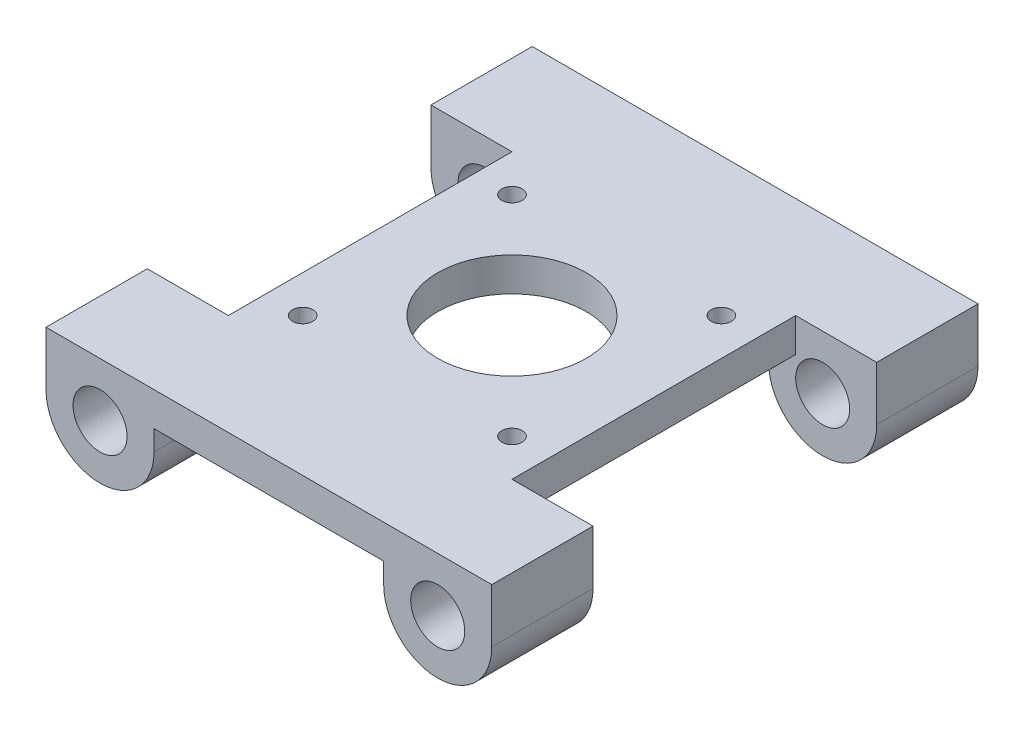
ISO-10303-21;
HEADER;
FILE_DESCRIPTION(('STEP AP214'),'2;1');
FILE_NAME('part.step','',(''),(''),'','','');
FILE_SCHEMA(('AUTOMOTIVE_DESIGN { 1 0 10303 214 1 1 1 1 }'));
ENDSEC;
DATA;
#1=APPLICATION_CONTEXT('core data for automotive mechanical design processes');
#2=APPLICATION_PROTOCOL_DEFINITION('international standard','automotive_design',2000,#1);
#3=PRODUCT_CONTEXT('',#1,'mechanical');
#4=PRODUCT('Part','Part','',(#3));
#5=PRODUCT_RELATED_PRODUCT_CATEGORY('part','',(#4));
#6=PRODUCT_DEFINITION_FORMATION('','',#4);
#7=PRODUCT_DEFINITION_CONTEXT('part definition',#1,'design');
#8=PRODUCT_DEFINITION('design','',#6,#7);
#9=PRODUCT_DEFINITION_SHAPE('','',#8);
#10=(LENGTH_UNIT() NAMED_UNIT(*) SI_UNIT(.MILLI.,.METRE.));
#11=(NAMED_UNIT(*) PLANE_ANGLE_UNIT() SI_UNIT($,.RADIAN.));
#12=(NAMED_UNIT(*) SI_UNIT($,.STERADIAN.) SOLID_ANGLE_UNIT());
#13=UNCERTAINTY_MEASURE_WITH_UNIT(LENGTH_MEASURE(1.E-05),#10,'distance_accuracy_value','');
#14=(GEOMETRIC_REPRESENTATION_CONTEXT(3) GLOBAL_UNCERTAINTY_ASSIGNED_CONTEXT((#13)) GLOBAL_UNIT_ASSIGNED_CONTEXT((#10,
#11,#12)) REPRESENTATION_CONTEXT('',''));
#15=CARTESIAN_POINT('',(0.,0.,0.));
#16=DIRECTION('',(0.,0.,1.));
#17=DIRECTION('',(1.,0.,0.));
#18=AXIS2_PLACEMENT_3D('',#15,#16,#17);
#19=CARTESIAN_POINT('',(-25.,-8.00000000000001,-15.));
#20=DIRECTION('',(0.,0.,1.));
#21=DIRECTION('',(1.,0.,0.));
#22=AXIS2_PLACEMENT_3D('',#19,#20,#21);
#23=PLANE('',#22);
#24=CARTESIAN_POINT('',(25.,-8.,-15.));
#25=DIRECTION('',(0.,0.,1.));
#26=DIRECTION('',(-1.,0.,0.));
#27=AXIS2_PLACEMENT_3D('',#24,#25,#26);
#28=CIRCLE('',#27,4.00000000000001);
#29=CARTESIAN_POINT('',(21.,-8.,-15.));
#30=VERTEX_POINT('',#29);
#31=EDGE_CURVE('E292',#30,#30,#28,.T.);
#32=ORIENTED_EDGE('',*,*,#31,.T.);
#33=EDGE_LOOP('',(#32));
#34=FACE_BOUND('',#33,.T.);
#35=DIRECTION('',(0.,-1.,0.));
#36=VECTOR('',#35,1.);
#37=CARTESIAN_POINT('',(21.,0.,-15.));
#38=LINE('',#37,#36);
#39=CARTESIAN_POINT('',(21.,0.,-15.));
#40=VERTEX_POINT('',#39);
#41=CARTESIAN_POINT('',(21.,-5.,-15.));
#42=VERTEX_POINT('',#41);
#43=EDGE_CURVE('E251',#40,#42,#38,.T.);
#44=ORIENTED_EDGE('',*,*,#43,.F.);
#45=DIRECTION('',(-1.,0.,0.));
#46=VECTOR('',#45,1.);
#47=CARTESIAN_POINT('',(33.,0.,-15.));
#48=LINE('',#47,#46);
#49=CARTESIAN_POINT('',(33.,0.,-15.));
#50=VERTEX_POINT('',#49);
#51=EDGE_CURVE('E335',#50,#40,#48,.T.);
#52=ORIENTED_EDGE('',*,*,#51,.F.);
#53=DIRECTION('',(0.,1.,0.));
#54=VECTOR('',#53,1.);
#55=CARTESIAN_POINT('',(33.,0.,-15.));
#56=LINE('',#55,#54);
#57=CARTESIAN_POINT('',(33.,-8.,-15.));
#58=VERTEX_POINT('',#57);
#59=EDGE_CURVE('E322',#58,#50,#56,.T.);
#60=ORIENTED_EDGE('',*,*,#59,.F.);
#61=CARTESIAN_POINT('',(25.,-8.,-15.));
#62=DIRECTION('',(0.,0.,1.));
#63=DIRECTION('',(-1.,0.,0.));
#64=AXIS2_PLACEMENT_3D('',#61,#62,#63);
#65=CIRCLE('',#64,7.99999999999999);
#66=CARTESIAN_POINT('',(17.,-8.,-15.));
#67=VERTEX_POINT('',#66);
#68=EDGE_CURVE('E318',#67,#58,#65,.T.);
#69=ORIENTED_EDGE('',*,*,#68,.F.);
#70=DIRECTION('',(0.,-1.,0.));
#71=VECTOR('',#70,1.);
#72=CARTESIAN_POINT('',(17.,-5.,-15.));
#73=LINE('',#72,#71);
#74=CARTESIAN_POINT('',(17.,-5.,-15.));
#75=VERTEX_POINT('',#74);
#76=EDGE_CURVE('E310',#75,#67,#73,.T.);
#77=ORIENTED_EDGE('',*,*,#76,.F.);
#78=DIRECTION('',(-1.,0.,0.));
#79=VECTOR('',#78,1.);
#80=CARTESIAN_POINT('',(21.,-5.,-15.));
#81=LINE('',#80,#79);
#82=EDGE_CURVE('E255',#42,#75,#81,.T.);
#83=ORIENTED_EDGE('',*,*,#82,.F.);
#84=EDGE_LOOP('',(#44,#52,#60,#69,#77,#83));
#85=FACE_BOUND('',#84,.T.);
#86=ADVANCED_FACE('F33',(#34,#85),#23,.F.);
#87=CARTESIAN_POINT('',(-25.,-8.00000000000001,-15.));
#88=DIRECTION('',(0.,0.,1.));
#89=DIRECTION('',(1.,0.,0.));
#90=AXIS2_PLACEMENT_3D('',#87,#88,#89);
#91=CIRCLE('',#90,4.00000000000001);
#92=CARTESIAN_POINT('',(-21.,-8.00000000000001,-15.));
#93=VERTEX_POINT('',#92);
#94=EDGE_CURVE('E370',#93,#93,#91,.T.);
#95=ORIENTED_EDGE('',*,*,#94,.T.);
#96=EDGE_LOOP('',(#95));
#97=FACE_BOUND('',#96,.T.);
#98=DIRECTION('',(0.,1.,0.));
#99=VECTOR('',#98,1.);
#100=CARTESIAN_POINT('',(-21.,0.,-15.));
#101=LINE('',#100,#99);
#102=CARTESIAN_POINT('',(-21.,-5.,-15.));
#103=VERTEX_POINT('',#102);
#104=CARTESIAN_POINT('',(-21.,0.,-15.));
#105=VERTEX_POINT('',#104);
#106=EDGE_CURVE('E261',#103,#105,#101,.T.);
#107=ORIENTED_EDGE('',*,*,#106,.F.);
#108=CARTESIAN_POINT('',(-17.,-5.00000000000001,-15.));
#109=VERTEX_POINT('',#108);
#110=EDGE_CURVE('E11',#109,#103,#81,.T.);
#111=ORIENTED_EDGE('',*,*,#110,.F.);
#112=DIRECTION('',(0.,1.,0.));
#113=VECTOR('',#112,1.);
#114=CARTESIAN_POINT('',(-17.,-5.00000000000001,-15.));
#115=LINE('',#114,#113);
#116=CARTESIAN_POINT('',(-17.,-8.00000000000001,-15.));
#117=VERTEX_POINT('',#116);
#118=EDGE_CURVE('E307',#117,#109,#115,.T.);
#119=ORIENTED_EDGE('',*,*,#118,.F.);
#120=CARTESIAN_POINT('',(-25.,-8.00000000000001,-15.));
#121=DIRECTION('',(0.,0.,1.));
#122=DIRECTION('',(1.,0.,0.));
#123=AXIS2_PLACEMENT_3D('',#120,#121,#122);
#124=CIRCLE('',#123,7.99999999999999);
#125=CARTESIAN_POINT('',(-33.,-8.00000000000001,-15.));
#126=VERTEX_POINT('',#125);
#127=EDGE_CURVE('E311',#126,#117,#124,.T.);
#128=ORIENTED_EDGE('',*,*,#127,.F.);
#129=DIRECTION('',(0.,-1.,0.));
#130=VECTOR('',#129,1.);
#131=CARTESIAN_POINT('',(-33.,0.,-15.));
#132=LINE('',#131,#130);
#133=CARTESIAN_POINT('',(-33.,0.,-15.));
#134=VERTEX_POINT('',#133);
#135=EDGE_CURVE('E350',#134,#126,#132,.T.);
#136=ORIENTED_EDGE('',*,*,#135,.F.);
#137=EDGE_CURVE('E296',#105,#134,#48,.T.);
#138=ORIENTED_EDGE('',*,*,#137,.F.);
#139=EDGE_LOOP('',(#107,#111,#119,#128,#136,#138));
#140=FACE_BOUND('',#139,.T.);
#141=ADVANCED_FACE('F390',(#97,#140),#23,.F.);
#142=CARTESIAN_POINT('',(-33.,0.,-15.));
#143=DIRECTION('',(-1.,0.,0.));
#144=DIRECTION('',(0.,-1.,0.));
#145=AXIS2_PLACEMENT_3D('',#142,#143,#144);
#146=PLANE('',#145);
#147=DIRECTION('',(0.,-1.,0.));
#148=VECTOR('',#147,1.);
#149=CARTESIAN_POINT('',(-33.,0.,0.));
#150=LINE('',#149,#148);
#151=CARTESIAN_POINT('',(-33.,0.,0.));
#152=VERTEX_POINT('',#151);
#153=CARTESIAN_POINT('',(-33.,-8.00000000000001,0.));
#154=VERTEX_POINT('',#153);
#155=EDGE_CURVE('E332',#152,#154,#150,.T.);
#156=ORIENTED_EDGE('',*,*,#155,.F.);
#157=DIRECTION('',(0.,0.,1.));
#158=VECTOR('',#157,1.);
#159=CARTESIAN_POINT('',(-33.,0.,-15.));
#160=LINE('',#159,#158);
#161=EDGE_CURVE('E42',#134,#152,#160,.T.);
#162=ORIENTED_EDGE('',*,*,#161,.F.);
#163=ORIENTED_EDGE('',*,*,#135,.T.);
#164=DIRECTION('',(0.,0.,1.));
#165=VECTOR('',#164,1.);
#166=CARTESIAN_POINT('',(-33.,-8.00000000000001,-15.));
#167=LINE('',#166,#165);
#168=EDGE_CURVE('E338',#126,#154,#167,.T.);
#169=ORIENTED_EDGE('',*,*,#168,.T.);
#170=EDGE_LOOP('',(#156,#162,#163,#169));
#171=FACE_BOUND('',#170,.T.);
#172=ADVANCED_FACE('F35',(#171),#146,.T.);
#173=CARTESIAN_POINT('',(33.,0.,-15.));
#174=DIRECTION('',(0.,1.,0.));
#175=DIRECTION('',(-1.,0.,0.));
#176=AXIS2_PLACEMENT_3D('',#173,#174,#175);
#177=PLANE('',#176);
#178=CARTESIAN_POINT('',(-15.4999999999997,0.,-20.5));
#179=DIRECTION('',(0.,1.,0.));
#180=DIRECTION('',(-1.,0.,0.));
#181=AXIS2_PLACEMENT_3D('',#178,#179,#180);
#182=CIRCLE('',#181,1.5);
#183=CARTESIAN_POINT('',(-16.9999999999997,0.,-20.5));
#184=VERTEX_POINT('',#183);
#185=EDGE_CURVE('E707',#184,#184,#182,.T.);
#186=ORIENTED_EDGE('',*,*,#185,.F.);
#187=EDGE_LOOP('',(#186));
#188=FACE_BOUND('',#187,.T.);
#189=CARTESIAN_POINT('',(15.5000000000003,0.,-20.5));
#190=DIRECTION('',(0.,1.,0.));
#191=DIRECTION('',(-1.,0.,0.));
#192=AXIS2_PLACEMENT_3D('',#189,#190,#191);
#193=CIRCLE('',#192,1.5);
#194=CARTESIAN_POINT('',(14.0000000000003,0.,-20.5));
#195=VERTEX_POINT('',#194);
#196=EDGE_CURVE('E709',#195,#195,#193,.T.);
#197=ORIENTED_EDGE('',*,*,#196,.F.);
#198=EDGE_LOOP('',(#197));
#199=FACE_BOUND('',#198,.T.);
#200=CARTESIAN_POINT('',(15.5,0.,-51.5));
#201=DIRECTION('',(0.,1.,0.));
#202=DIRECTION('',(-1.,0.,0.));
#203=AXIS2_PLACEMENT_3D('',#200,#201,#202);
#204=CIRCLE('',#203,1.5);
#205=CARTESIAN_POINT('',(14.,0.,-51.5));
#206=VERTEX_POINT('',#205);
#207=EDGE_CURVE('E714',#206,#206,#204,.T.);
#208=ORIENTED_EDGE('',*,*,#207,.F.);
#209=EDGE_LOOP('',(#208));
#210=FACE_BOUND('',#209,.T.);
#211=CARTESIAN_POINT('',(0.,0.,-36.));
#212=DIRECTION('',(0.,1.,0.));
#213=DIRECTION('',(-1.,0.,0.));
#214=AXIS2_PLACEMENT_3D('',#211,#212,#213);
#215=CIRCLE('',#214,11.);
#216=CARTESIAN_POINT('',(-11.,0.,-36.));
#217=VERTEX_POINT('',#216);
#218=EDGE_CURVE('E718',#217,#217,#215,.T.);
#219=ORIENTED_EDGE('',*,*,#218,.F.);
#220=EDGE_LOOP('',(#219));
#221=FACE_BOUND('',#220,.T.);
#222=CARTESIAN_POINT('',(-15.5,0.,-51.5));
#223=DIRECTION('',(0.,1.,0.));
#224=DIRECTION('',(-1.,0.,0.));
#225=AXIS2_PLACEMENT_3D('',#222,#223,#224);
#226=CIRCLE('',#225,1.5);
#227=CARTESIAN_POINT('',(-17.,0.,-51.5));
#228=VERTEX_POINT('',#227);
#229=EDGE_CURVE('E722',#228,#228,#226,.T.);
#230=ORIENTED_EDGE('',*,*,#229,.F.);
#231=EDGE_LOOP('',(#230));
#232=FACE_BOUND('',#231,.T.);
#233=DIRECTION('',(-1.,0.,0.));
#234=VECTOR('',#233,1.);
#235=CARTESIAN_POINT('',(33.,0.,0.));
#236=LINE('',#235,#234);
#237=CARTESIAN_POINT('',(33.,0.,0.));
#238=VERTEX_POINT('',#237);
#239=EDGE_CURVE('E347',#238,#152,#236,.T.);
#240=ORIENTED_EDGE('',*,*,#239,.F.);
#241=DIRECTION('',(0.,0.,1.));
#242=VECTOR('',#241,1.);
#243=CARTESIAN_POINT('',(33.,0.,-15.));
#244=LINE('',#243,#242);
#245=EDGE_CURVE('E344',#50,#238,#244,.T.);
#246=ORIENTED_EDGE('',*,*,#245,.F.);
#247=ORIENTED_EDGE('',*,*,#51,.T.);
#248=DIRECTION('',(0.,0.,1.));
#249=VECTOR('',#248,1.);
#250=CARTESIAN_POINT('',(21.,0.,-57.));
#251=LINE('',#250,#249);
#252=CARTESIAN_POINT('',(21.,0.,-57.));
#253=VERTEX_POINT('',#252);
#254=EDGE_CURVE('E269',#253,#40,#251,.T.);
#255=ORIENTED_EDGE('',*,*,#254,.F.);
#256=DIRECTION('',(-1.,0.,0.));
#257=VECTOR('',#256,1.);
#258=CARTESIAN_POINT('',(33.,0.,-57.));
#259=LINE('',#258,#257);
#260=CARTESIAN_POINT('',(33.,0.,-57.));
#261=VERTEX_POINT('',#260);
#262=EDGE_CURVE('E200',#261,#253,#259,.T.);
#263=ORIENTED_EDGE('',*,*,#262,.F.);
#264=DIRECTION('',(0.,0.,1.));
#265=VECTOR('',#264,1.);
#266=CARTESIAN_POINT('',(33.,0.,-72.));
#267=LINE('',#266,#265);
#268=CARTESIAN_POINT('',(33.,0.,-72.));
#269=VERTEX_POINT('',#268);
#270=EDGE_CURVE('E248',#269,#261,#267,.T.);
#271=ORIENTED_EDGE('',*,*,#270,.F.);
#272=DIRECTION('',(-1.,0.,0.));
#273=VECTOR('',#272,1.);
#274=CARTESIAN_POINT('',(33.,0.,-72.));
#275=LINE('',#274,#273);
#276=CARTESIAN_POINT('',(-33.,0.,-72.));
#277=VERTEX_POINT('',#276);
#278=EDGE_CURVE('E184',#269,#277,#275,.T.);
#279=ORIENTED_EDGE('',*,*,#278,.T.);
#280=DIRECTION('',(0.,0.,1.));
#281=VECTOR('',#280,1.);
#282=CARTESIAN_POINT('',(-33.,0.,-72.));
#283=LINE('',#282,#281);
#284=CARTESIAN_POINT('',(-33.,0.,-57.));
#285=VERTEX_POINT('',#284);
#286=EDGE_CURVE('E199',#277,#285,#283,.T.);
#287=ORIENTED_EDGE('',*,*,#286,.T.);
#288=CARTESIAN_POINT('',(-21.,0.,-57.));
#289=VERTEX_POINT('',#288);
#290=EDGE_CURVE('E203',#289,#285,#259,.T.);
#291=ORIENTED_EDGE('',*,*,#290,.F.);
#292=DIRECTION('',(0.,0.,1.));
#293=VECTOR('',#292,1.);
#294=CARTESIAN_POINT('',(-21.,0.,-57.));
#295=LINE('',#294,#293);
#296=EDGE_CURVE('E271',#289,#105,#295,.T.);
#297=ORIENTED_EDGE('',*,*,#296,.T.);
#298=ORIENTED_EDGE('',*,*,#137,.T.);
#299=ORIENTED_EDGE('',*,*,#161,.T.);
#300=EDGE_LOOP('',(#240,#246,#247,#255,#263,#271,#279,#287,#291,#297,#298,#299));
#301=FACE_BOUND('',#300,.T.);
#302=ADVANCED_FACE('F404',(#188,#199,#210,#221,#232,#301),#177,.T.);
#303=CARTESIAN_POINT('',(33.,0.,-15.));
#304=DIRECTION('',(1.,0.,0.));
#305=DIRECTION('',(0.,1.,0.));
#306=AXIS2_PLACEMENT_3D('',#303,#304,#305);
#307=PLANE('',#306);
#308=DIRECTION('',(0.,1.,0.));
#309=VECTOR('',#308,1.);
#310=CARTESIAN_POINT('',(33.,0.,0.));
#311=LINE('',#310,#309);
#312=CARTESIAN_POINT('',(33.,-8.,0.));
#313=VERTEX_POINT('',#312);
#314=EDGE_CURVE('E351',#313,#238,#311,.T.);
#315=ORIENTED_EDGE('',*,*,#314,.F.);
#316=DIRECTION('',(0.,0.,1.));
#317=VECTOR('',#316,1.);
#318=CARTESIAN_POINT('',(33.,-8.,-15.));
#319=LINE('',#318,#317);
#320=EDGE_CURVE('E342',#58,#313,#319,.T.);
#321=ORIENTED_EDGE('',*,*,#320,.F.);
#322=ORIENTED_EDGE('',*,*,#59,.T.);
#323=ORIENTED_EDGE('',*,*,#245,.T.);
#324=EDGE_LOOP('',(#315,#321,#322,#323));
#325=FACE_BOUND('',#324,.T.);
#326=ADVANCED_FACE('F411',(#325),#307,.T.);
#327=CARTESIAN_POINT('',(25.,-8.,-15.));
#328=DIRECTION('',(0.,0.,1.));
#329=DIRECTION('',(1.,0.,0.));
#330=AXIS2_PLACEMENT_3D('',#327,#328,#329);
#331=CYLINDRICAL_SURFACE('',#330,7.99999999999999);
#332=CARTESIAN_POINT('',(25.,-8.,0.));
#333=DIRECTION('',(0.,0.,1.));
#334=DIRECTION('',(-1.,0.,0.));
#335=AXIS2_PLACEMENT_3D('',#332,#333,#334);
#336=CIRCLE('',#335,7.99999999999999);
#337=CARTESIAN_POINT('',(17.,-8.,0.));
#338=VERTEX_POINT('',#337);
#339=EDGE_CURVE('E354',#338,#313,#336,.T.);
#340=ORIENTED_EDGE('',*,*,#339,.F.);
#341=DIRECTION('',(0.,0.,1.));
#342=VECTOR('',#341,1.);
#343=CARTESIAN_POINT('',(17.,-8.,-15.));
#344=LINE('',#343,#342);
#345=EDGE_CURVE('E315',#67,#338,#344,.T.);
#346=ORIENTED_EDGE('',*,*,#345,.F.);
#347=ORIENTED_EDGE('',*,*,#68,.T.);
#348=ORIENTED_EDGE('',*,*,#320,.T.);
#349=EDGE_LOOP('',(#340,#346,#347,#348));
#350=FACE_BOUND('',#349,.T.);
#351=ADVANCED_FACE('F400',(#350),#331,.T.);
#352=CARTESIAN_POINT('',(17.,-5.,-15.));
#353=DIRECTION('',(-1.,0.,0.));
#354=DIRECTION('',(0.,0.,1.));
#355=AXIS2_PLACEMENT_3D('',#352,#353,#354);
#356=PLANE('',#355);
#357=DIRECTION('',(0.,-1.,0.));
#358=VECTOR('',#357,1.);
#359=CARTESIAN_POINT('',(17.,-5.,0.));
#360=LINE('',#359,#358);
#361=CARTESIAN_POINT('',(17.,-5.,0.));
#362=VERTEX_POINT('',#361);
#363=EDGE_CURVE('E357',#362,#338,#360,.T.);
#364=ORIENTED_EDGE('',*,*,#363,.F.);
#365=DIRECTION('',(0.,0.,1.));
#366=VECTOR('',#365,1.);
#367=CARTESIAN_POINT('',(17.,-5.,-15.));
#368=LINE('',#367,#366);
#369=EDGE_CURVE('E303',#75,#362,#368,.T.);
#370=ORIENTED_EDGE('',*,*,#369,.F.);
#371=ORIENTED_EDGE('',*,*,#76,.T.);
#372=ORIENTED_EDGE('',*,*,#345,.T.);
#373=EDGE_LOOP('',(#364,#370,#371,#372));
#374=FACE_BOUND('',#373,.T.);
#375=ADVANCED_FACE('F398',(#374),#356,.T.);
#376=CARTESIAN_POINT('',(17.,-5.,-15.));
#377=DIRECTION('',(0.,-1.,0.));
#378=DIRECTION('',(1.,0.,0.));
#379=AXIS2_PLACEMENT_3D('',#376,#377,#378);
#380=PLANE('',#379);
#381=CARTESIAN_POINT('',(-15.4999999999997,-5.,-20.5));
#382=DIRECTION('',(0.,-1.,0.));
#383=DIRECTION('',(1.,0.,0.));
#384=AXIS2_PLACEMENT_3D('',#381,#382,#383);
#385=CIRCLE('',#384,1.5);
#386=CARTESIAN_POINT('',(-13.9999999999997,-5.,-20.5));
#387=VERTEX_POINT('',#386);
#388=EDGE_CURVE('E37',#387,#387,#385,.T.);
#389=ORIENTED_EDGE('',*,*,#388,.F.);
#390=EDGE_LOOP('',(#389));
#391=FACE_BOUND('',#390,.T.);
#392=CARTESIAN_POINT('',(15.5000000000003,-5.,-20.5));
#393=DIRECTION('',(0.,-1.,0.));
#394=DIRECTION('',(1.,0.,0.));
#395=AXIS2_PLACEMENT_3D('',#392,#393,#394);
#396=CIRCLE('',#395,1.5);
#397=CARTESIAN_POINT('',(17.0000000000003,-5.,-20.5));
#398=VERTEX_POINT('',#397);
#399=EDGE_CURVE('E713',#398,#398,#396,.T.);
#400=ORIENTED_EDGE('',*,*,#399,.F.);
#401=EDGE_LOOP('',(#400));
#402=FACE_BOUND('',#401,.T.);
#403=CARTESIAN_POINT('',(15.5,-5.,-51.5));
#404=DIRECTION('',(0.,-1.,0.));
#405=DIRECTION('',(1.,0.,0.));
#406=AXIS2_PLACEMENT_3D('',#403,#404,#405);
#407=CIRCLE('',#406,1.5);
#408=CARTESIAN_POINT('',(17.,-5.,-51.5));
#409=VERTEX_POINT('',#408);
#410=EDGE_CURVE('E717',#409,#409,#407,.T.);
#411=ORIENTED_EDGE('',*,*,#410,.F.);
#412=EDGE_LOOP('',(#411));
#413=FACE_BOUND('',#412,.T.);
#414=CARTESIAN_POINT('',(0.,-5.,-36.));
#415=DIRECTION('',(0.,-1.,0.));
#416=DIRECTION('',(1.,0.,0.));
#417=AXIS2_PLACEMENT_3D('',#414,#415,#416);
#418=CIRCLE('',#417,11.);
#419=CARTESIAN_POINT('',(11.,-5.,-36.));
#420=VERTEX_POINT('',#419);
#421=EDGE_CURVE('E721',#420,#420,#418,.T.);
#422=ORIENTED_EDGE('',*,*,#421,.F.);
#423=EDGE_LOOP('',(#422));
#424=FACE_BOUND('',#423,.T.);
#425=CARTESIAN_POINT('',(-15.5,-5.,-51.5));
#426=DIRECTION('',(0.,-1.,0.));
#427=DIRECTION('',(1.,0.,0.));
#428=AXIS2_PLACEMENT_3D('',#425,#426,#427);
#429=CIRCLE('',#428,1.5);
#430=CARTESIAN_POINT('',(-14.,-5.,-51.5));
#431=VERTEX_POINT('',#430);
#432=EDGE_CURVE('E725',#431,#431,#429,.T.);
#433=ORIENTED_EDGE('',*,*,#432,.F.);
#434=EDGE_LOOP('',(#433));
#435=FACE_BOUND('',#434,.T.);
#436=DIRECTION('',(1.,0.,0.));
#437=VECTOR('',#436,1.);
#438=CARTESIAN_POINT('',(17.,-5.,0.));
#439=LINE('',#438,#437);
#440=CARTESIAN_POINT('',(-17.,-5.00000000000001,0.));
#441=VERTEX_POINT('',#440);
#442=EDGE_CURVE('E360',#441,#362,#439,.T.);
#443=ORIENTED_EDGE('',*,*,#442,.F.);
#444=DIRECTION('',(0.,0.,1.));
#445=VECTOR('',#444,1.);
#446=CARTESIAN_POINT('',(-17.,-5.00000000000001,-15.));
#447=LINE('',#446,#445);
#448=EDGE_CURVE('E301',#109,#441,#447,.T.);
#449=ORIENTED_EDGE('',*,*,#448,.F.);
#450=ORIENTED_EDGE('',*,*,#110,.T.);
#451=DIRECTION('',(0.,0.,1.));
#452=VECTOR('',#451,1.);
#453=CARTESIAN_POINT('',(-21.,-5.,-57.));
#454=LINE('',#453,#452);
#455=CARTESIAN_POINT('',(-21.,-5.,-57.));
#456=VERTEX_POINT('',#455);
#457=EDGE_CURVE('E284',#456,#103,#454,.T.);
#458=ORIENTED_EDGE('',*,*,#457,.F.);
#459=DIRECTION('',(-1.,0.,0.));
#460=VECTOR('',#459,1.);
#461=CARTESIAN_POINT('',(21.,-5.,-57.));
#462=LINE('',#461,#460);
#463=CARTESIAN_POINT('',(-17.,-5.,-57.));
#464=VERTEX_POINT('',#463);
#465=EDGE_CURVE('E50',#464,#456,#462,.T.);
#466=ORIENTED_EDGE('',*,*,#465,.F.);
#467=DIRECTION('',(0.,0.,1.));
#468=VECTOR('',#467,1.);
#469=CARTESIAN_POINT('',(-17.,-5.00000000000001,-72.));
#470=LINE('',#469,#468);
#471=CARTESIAN_POINT('',(-17.,-5.00000000000001,-72.));
#472=VERTEX_POINT('',#471);
#473=EDGE_CURVE('E243',#472,#464,#470,.T.);
#474=ORIENTED_EDGE('',*,*,#473,.F.);
#475=DIRECTION('',(1.,0.,0.));
#476=VECTOR('',#475,1.);
#477=CARTESIAN_POINT('',(17.,-5.,-72.));
#478=LINE('',#477,#476);
#479=CARTESIAN_POINT('',(17.,-5.,-72.));
#480=VERTEX_POINT('',#479);
#481=EDGE_CURVE('E210',#472,#480,#478,.T.);
#482=ORIENTED_EDGE('',*,*,#481,.T.);
#483=DIRECTION('',(0.,0.,1.));
#484=VECTOR('',#483,1.);
#485=CARTESIAN_POINT('',(17.,-5.,-72.));
#486=LINE('',#485,#484);
#487=CARTESIAN_POINT('',(17.,-5.,-57.));
#488=VERTEX_POINT('',#487);
#489=EDGE_CURVE('E247',#480,#488,#486,.T.);
#490=ORIENTED_EDGE('',*,*,#489,.T.);
#491=CARTESIAN_POINT('',(21.,-5.,-57.));
#492=VERTEX_POINT('',#491);
#493=EDGE_CURVE('E58',#492,#488,#462,.T.);
#494=ORIENTED_EDGE('',*,*,#493,.F.);
#495=DIRECTION('',(0.,0.,1.));
#496=VECTOR('',#495,1.);
#497=CARTESIAN_POINT('',(21.,-5.,-57.));
#498=LINE('',#497,#496);
#499=EDGE_CURVE('E287',#492,#42,#498,.T.);
#500=ORIENTED_EDGE('',*,*,#499,.T.);
#501=ORIENTED_EDGE('',*,*,#82,.T.);
#502=ORIENTED_EDGE('',*,*,#369,.T.);
#503=EDGE_LOOP('',(#443,#449,#450,#458,#466,#474,#482,#490,#494,#500,#501,#502));
#504=FACE_BOUND('',#503,.T.);
#505=ADVANCED_FACE('F397',(#391,#402,#413,#424,#435,#504),#380,.T.);
#506=CARTESIAN_POINT('',(-17.,-5.00000000000001,-15.));
#507=DIRECTION('',(1.,0.,0.));
#508=DIRECTION('',(0.,0.,-1.));
#509=AXIS2_PLACEMENT_3D('',#506,#507,#508);
#510=PLANE('',#509);
#511=DIRECTION('',(0.,1.,0.));
#512=VECTOR('',#511,1.);
#513=CARTESIAN_POINT('',(-17.,-5.00000000000001,0.));
#514=LINE('',#513,#512);
#515=CARTESIAN_POINT('',(-17.,-8.00000000000001,0.));
#516=VERTEX_POINT('',#515);
#517=EDGE_CURVE('E363',#516,#441,#514,.T.);
#518=ORIENTED_EDGE('',*,*,#517,.F.);
#519=DIRECTION('',(0.,0.,1.));
#520=VECTOR('',#519,1.);
#521=CARTESIAN_POINT('',(-17.,-8.00000000000001,-15.));
#522=LINE('',#521,#520);
#523=EDGE_CURVE('E304',#117,#516,#522,.T.);
#524=ORIENTED_EDGE('',*,*,#523,.F.);
#525=ORIENTED_EDGE('',*,*,#118,.T.);
#526=ORIENTED_EDGE('',*,*,#448,.T.);
#527=EDGE_LOOP('',(#518,#524,#525,#526));
#528=FACE_BOUND('',#527,.T.);
#529=ADVANCED_FACE('F393',(#528),#510,.T.);
#530=CARTESIAN_POINT('',(-25.,-8.00000000000001,-15.));
#531=DIRECTION('',(0.,0.,1.));
#532=DIRECTION('',(1.,0.,0.));
#533=AXIS2_PLACEMENT_3D('',#530,#531,#532);
#534=CYLINDRICAL_SURFACE('',#533,7.99999999999999);
#535=CARTESIAN_POINT('',(-25.,-8.00000000000001,0.));
#536=DIRECTION('',(0.,0.,1.));
#537=DIRECTION('',(1.,0.,0.));
#538=AXIS2_PLACEMENT_3D('',#535,#536,#537);
#539=CIRCLE('',#538,7.99999999999999);
#540=EDGE_CURVE('E365',#154,#516,#539,.T.);
#541=ORIENTED_EDGE('',*,*,#540,.F.);
#542=ORIENTED_EDGE('',*,*,#168,.F.);
#543=ORIENTED_EDGE('',*,*,#127,.T.);
#544=ORIENTED_EDGE('',*,*,#523,.T.);
#545=EDGE_LOOP('',(#541,#542,#543,#544));
#546=FACE_BOUND('',#545,.T.);
#547=ADVANCED_FACE('F386',(#546),#534,.T.);
#548=CARTESIAN_POINT('',(-25.,-8.00000000000001,0.));
#549=DIRECTION('',(0.,0.,1.));
#550=DIRECTION('',(1.,0.,0.));
#551=AXIS2_PLACEMENT_3D('',#548,#549,#550);
#552=PLANE('',#551);
#553=CARTESIAN_POINT('',(25.,-8.,0.));
#554=DIRECTION('',(0.,0.,1.));
#555=DIRECTION('',(-1.,0.,0.));
#556=AXIS2_PLACEMENT_3D('',#553,#554,#555);
#557=CIRCLE('',#556,4.00000000000001);
#558=CARTESIAN_POINT('',(21.,-8.,0.));
#559=VERTEX_POINT('',#558);
#560=EDGE_CURVE('E289',#559,#559,#557,.T.);
#561=ORIENTED_EDGE('',*,*,#560,.F.);
#562=EDGE_LOOP('',(#561));
#563=FACE_BOUND('',#562,.T.);
#564=CARTESIAN_POINT('',(-25.,-8.00000000000001,0.));
#565=DIRECTION('',(0.,0.,1.));
#566=DIRECTION('',(1.,0.,0.));
#567=AXIS2_PLACEMENT_3D('',#564,#565,#566);
#568=CIRCLE('',#567,4.00000000000001);
#569=CARTESIAN_POINT('',(-21.,-8.00000000000001,0.));
#570=VERTEX_POINT('',#569);
#571=EDGE_CURVE('E373',#570,#570,#568,.T.);
#572=ORIENTED_EDGE('',*,*,#571,.F.);
#573=EDGE_LOOP('',(#572));
#574=FACE_BOUND('',#573,.T.);
#575=ORIENTED_EDGE('',*,*,#155,.T.);
#576=ORIENTED_EDGE('',*,*,#540,.T.);
#577=ORIENTED_EDGE('',*,*,#517,.T.);
#578=ORIENTED_EDGE('',*,*,#442,.T.);
#579=ORIENTED_EDGE('',*,*,#363,.T.);
#580=ORIENTED_EDGE('',*,*,#339,.T.);
#581=ORIENTED_EDGE('',*,*,#314,.T.);
#582=ORIENTED_EDGE('',*,*,#239,.T.);
#583=EDGE_LOOP('',(#575,#576,#577,#578,#579,#580,#581,#582));
#584=FACE_BOUND('',#583,.T.);
#585=ADVANCED_FACE('F395',(#563,#574,#584),#552,.T.);
#586=CARTESIAN_POINT('',(-25.,-8.00000000000001,-15.));
#587=DIRECTION('',(0.,0.,1.));
#588=DIRECTION('',(1.,0.,0.));
#589=AXIS2_PLACEMENT_3D('',#586,#587,#588);
#590=CYLINDRICAL_SURFACE('',#589,4.00000000000001);
#591=ORIENTED_EDGE('',*,*,#94,.F.);
#592=EDGE_LOOP('',(#591));
#593=FACE_BOUND('',#592,.T.);
#594=ORIENTED_EDGE('',*,*,#571,.T.);
#595=EDGE_LOOP('',(#594));
#596=FACE_BOUND('',#595,.T.);
#597=ADVANCED_FACE('F423',(#593,#596),#590,.F.);
#598=CARTESIAN_POINT('',(25.,-8.,-15.));
#599=DIRECTION('',(0.,0.,1.));
#600=DIRECTION('',(1.,0.,0.));
#601=AXIS2_PLACEMENT_3D('',#598,#599,#600);
#602=CYLINDRICAL_SURFACE('',#601,4.00000000000001);
#603=ORIENTED_EDGE('',*,*,#31,.F.);
#604=EDGE_LOOP('',(#603));
#605=FACE_BOUND('',#604,.T.);
#606=ORIENTED_EDGE('',*,*,#560,.T.);
#607=EDGE_LOOP('',(#606));
#608=FACE_BOUND('',#607,.T.);
#609=ADVANCED_FACE('F454',(#605,#608),#602,.F.);
#610=CARTESIAN_POINT('',(21.,0.,-57.));
#611=DIRECTION('',(-1.,0.,0.));
#612=DIRECTION('',(0.,0.,1.));
#613=AXIS2_PLACEMENT_3D('',#610,#611,#612);
#614=PLANE('',#613);
#615=ORIENTED_EDGE('',*,*,#43,.T.);
#616=ORIENTED_EDGE('',*,*,#499,.F.);
#617=DIRECTION('',(0.,-1.,0.));
#618=VECTOR('',#617,1.);
#619=CARTESIAN_POINT('',(21.,0.,-57.));
#620=LINE('',#619,#618);
#621=EDGE_CURVE('E278',#253,#492,#620,.T.);
#622=ORIENTED_EDGE('',*,*,#621,.F.);
#623=ORIENTED_EDGE('',*,*,#254,.T.);
#624=EDGE_LOOP('',(#615,#616,#622,#623));
#625=FACE_BOUND('',#624,.T.);
#626=ADVANCED_FACE('F461',(#625),#614,.F.);
#627=CARTESIAN_POINT('',(-21.,0.,-57.));
#628=DIRECTION('',(1.,0.,0.));
#629=DIRECTION('',(0.,0.,-1.));
#630=AXIS2_PLACEMENT_3D('',#627,#628,#629);
#631=PLANE('',#630);
#632=ORIENTED_EDGE('',*,*,#106,.T.);
#633=ORIENTED_EDGE('',*,*,#296,.F.);
#634=DIRECTION('',(0.,1.,0.));
#635=VECTOR('',#634,1.);
#636=CARTESIAN_POINT('',(-21.,0.,-57.));
#637=LINE('',#636,#635);
#638=EDGE_CURVE('E272',#456,#289,#637,.T.);
#639=ORIENTED_EDGE('',*,*,#638,.F.);
#640=ORIENTED_EDGE('',*,*,#457,.T.);
#641=EDGE_LOOP('',(#632,#633,#639,#640));
#642=FACE_BOUND('',#641,.T.);
#643=ADVANCED_FACE('F468',(#642),#631,.F.);
#644=CARTESIAN_POINT('',(-25.,-8.00000000000001,-57.));
#645=DIRECTION('',(0.,0.,1.));
#646=DIRECTION('',(1.,0.,0.));
#647=AXIS2_PLACEMENT_3D('',#644,#645,#646);
#648=PLANE('',#647);
#649=CARTESIAN_POINT('',(25.,-8.,-57.));
#650=DIRECTION('',(0.,0.,1.));
#651=DIRECTION('',(-1.,0.,0.));
#652=AXIS2_PLACEMENT_3D('',#649,#650,#651);
#653=CIRCLE('',#652,4.00000000000001);
#654=CARTESIAN_POINT('',(21.,-8.,-57.));
#655=VERTEX_POINT('',#654);
#656=EDGE_CURVE('E729',#655,#655,#653,.T.);
#657=ORIENTED_EDGE('',*,*,#656,.F.);
#658=EDGE_LOOP('',(#657));
#659=FACE_BOUND('',#658,.T.);
#660=ORIENTED_EDGE('',*,*,#262,.T.);
#661=ORIENTED_EDGE('',*,*,#621,.T.);
#662=ORIENTED_EDGE('',*,*,#493,.T.);
#663=DIRECTION('',(0.,-1.,0.));
#664=VECTOR('',#663,1.);
#665=CARTESIAN_POINT('',(17.,-5.,-57.));
#666=LINE('',#665,#664);
#667=CARTESIAN_POINT('',(17.,-8.,-57.));
#668=VERTEX_POINT('',#667);
#669=EDGE_CURVE('E232',#488,#668,#666,.T.);
#670=ORIENTED_EDGE('',*,*,#669,.T.);
#671=CARTESIAN_POINT('',(25.,-8.,-57.));
#672=DIRECTION('',(0.,0.,1.));
#673=DIRECTION('',(-1.,0.,0.));
#674=AXIS2_PLACEMENT_3D('',#671,#672,#673);
#675=CIRCLE('',#674,7.99999999999999);
#676=CARTESIAN_POINT('',(33.,-8.,-57.));
#677=VERTEX_POINT('',#676);
#678=EDGE_CURVE('E228',#668,#677,#675,.T.);
#679=ORIENTED_EDGE('',*,*,#678,.T.);
#680=DIRECTION('',(0.,1.,0.));
#681=VECTOR('',#680,1.);
#682=CARTESIAN_POINT('',(33.,0.,-57.));
#683=LINE('',#682,#681);
#684=EDGE_CURVE('E231',#677,#261,#683,.T.);
#685=ORIENTED_EDGE('',*,*,#684,.T.);
#686=EDGE_LOOP('',(#660,#661,#662,#670,#679,#685));
#687=FACE_BOUND('',#686,.T.);
#688=ADVANCED_FACE('F475',(#659,#687),#648,.T.);
#689=CARTESIAN_POINT('',(-33.,0.,-72.));
#690=DIRECTION('',(-1.,0.,0.));
#691=DIRECTION('',(0.,-1.,0.));
#692=AXIS2_PLACEMENT_3D('',#689,#690,#691);
#693=PLANE('',#692);
#694=DIRECTION('',(0.,-1.,0.));
#695=VECTOR('',#694,1.);
#696=CARTESIAN_POINT('',(-33.,0.,-57.));
#697=LINE('',#696,#695);
#698=CARTESIAN_POINT('',(-33.,-8.00000000000001,-57.));
#699=VERTEX_POINT('',#698);
#700=EDGE_CURVE('E223',#285,#699,#697,.T.);
#701=ORIENTED_EDGE('',*,*,#700,.F.);
#702=ORIENTED_EDGE('',*,*,#286,.F.);
#703=DIRECTION('',(0.,-1.,0.));
#704=VECTOR('',#703,1.);
#705=CARTESIAN_POINT('',(-33.,0.,-72.));
#706=LINE('',#705,#704);
#707=CARTESIAN_POINT('',(-33.,-8.00000000000001,-72.));
#708=VERTEX_POINT('',#707);
#709=EDGE_CURVE('E191',#277,#708,#706,.T.);
#710=ORIENTED_EDGE('',*,*,#709,.T.);
#711=DIRECTION('',(0.,0.,1.));
#712=VECTOR('',#711,1.);
#713=CARTESIAN_POINT('',(-33.,-8.00000000000001,-72.));
#714=LINE('',#713,#712);
#715=EDGE_CURVE('E173',#708,#699,#714,.T.);
#716=ORIENTED_EDGE('',*,*,#715,.T.);
#717=EDGE_LOOP('',(#701,#702,#710,#716));
#718=FACE_BOUND('',#717,.T.);
#719=ADVANCED_FACE('F197',(#718),#693,.T.);
#720=CARTESIAN_POINT('',(33.,0.,-72.));
#721=DIRECTION('',(1.,0.,0.));
#722=DIRECTION('',(0.,1.,0.));
#723=AXIS2_PLACEMENT_3D('',#720,#721,#722);
#724=PLANE('',#723);
#725=ORIENTED_EDGE('',*,*,#684,.F.);
#726=DIRECTION('',(0.,0.,1.));
#727=VECTOR('',#726,1.);
#728=CARTESIAN_POINT('',(33.,-8.,-72.));
#729=LINE('',#728,#727);
#730=CARTESIAN_POINT('',(33.,-8.,-72.));
#731=VERTEX_POINT('',#730);
#732=EDGE_CURVE('E246',#731,#677,#729,.T.);
#733=ORIENTED_EDGE('',*,*,#732,.F.);
#734=DIRECTION('',(0.,1.,0.));
#735=VECTOR('',#734,1.);
#736=CARTESIAN_POINT('',(33.,0.,-72.));
#737=LINE('',#736,#735);
#738=EDGE_CURVE('E219',#731,#269,#737,.T.);
#739=ORIENTED_EDGE('',*,*,#738,.T.);
#740=ORIENTED_EDGE('',*,*,#270,.T.);
#741=EDGE_LOOP('',(#725,#733,#739,#740));
#742=FACE_BOUND('',#741,.T.);
#743=ADVANCED_FACE('F491',(#742),#724,.T.);
#744=CARTESIAN_POINT('',(25.,-8.,-72.));
#745=DIRECTION('',(0.,0.,1.));
#746=DIRECTION('',(1.,0.,0.));
#747=AXIS2_PLACEMENT_3D('',#744,#745,#746);
#748=CYLINDRICAL_SURFACE('',#747,7.99999999999999);
#749=ORIENTED_EDGE('',*,*,#678,.F.);
#750=DIRECTION('',(0.,0.,1.));
#751=VECTOR('',#750,1.);
#752=CARTESIAN_POINT('',(17.,-8.,-72.));
#753=LINE('',#752,#751);
#754=CARTESIAN_POINT('',(17.,-8.,-72.));
#755=VERTEX_POINT('',#754);
#756=EDGE_CURVE('E244',#755,#668,#753,.T.);
#757=ORIENTED_EDGE('',*,*,#756,.F.);
#758=CARTESIAN_POINT('',(25.,-8.,-72.));
#759=DIRECTION('',(0.,0.,1.));
#760=DIRECTION('',(-1.,0.,0.));
#761=AXIS2_PLACEMENT_3D('',#758,#759,#760);
#762=CIRCLE('',#761,7.99999999999999);
#763=EDGE_CURVE('E216',#755,#731,#762,.T.);
#764=ORIENTED_EDGE('',*,*,#763,.T.);
#765=ORIENTED_EDGE('',*,*,#732,.T.);
#766=EDGE_LOOP('',(#749,#757,#764,#765));
#767=FACE_BOUND('',#766,.T.);
#768=ADVANCED_FACE('F498',(#767),#748,.T.);
#769=CARTESIAN_POINT('',(17.,-5.,-72.));
#770=DIRECTION('',(-1.,0.,0.));
#771=DIRECTION('',(0.,0.,1.));
#772=AXIS2_PLACEMENT_3D('',#769,#770,#771);
#773=PLANE('',#772);
#774=ORIENTED_EDGE('',*,*,#669,.F.);
#775=ORIENTED_EDGE('',*,*,#489,.F.);
#776=DIRECTION('',(0.,-1.,0.));
#777=VECTOR('',#776,1.);
#778=CARTESIAN_POINT('',(17.,-5.,-72.));
#779=LINE('',#778,#777);
#780=EDGE_CURVE('E213',#480,#755,#779,.T.);
#781=ORIENTED_EDGE('',*,*,#780,.T.);
#782=ORIENTED_EDGE('',*,*,#756,.T.);
#783=EDGE_LOOP('',(#774,#775,#781,#782));
#784=FACE_BOUND('',#783,.T.);
#785=ADVANCED_FACE('F505',(#784),#773,.T.);
#786=CARTESIAN_POINT('',(-17.,-5.00000000000001,-72.));
#787=DIRECTION('',(1.,0.,0.));
#788=DIRECTION('',(0.,0.,-1.));
#789=AXIS2_PLACEMENT_3D('',#786,#787,#788);
#790=PLANE('',#789);
#791=DIRECTION('',(0.,1.,0.));
#792=VECTOR('',#791,1.);
#793=CARTESIAN_POINT('',(-17.,-5.00000000000001,-57.));
#794=LINE('',#793,#792);
#795=CARTESIAN_POINT('',(-17.,-8.00000000000001,-57.));
#796=VERTEX_POINT('',#795);
#797=EDGE_CURVE('E227',#796,#464,#794,.T.);
#798=ORIENTED_EDGE('',*,*,#797,.F.);
#799=DIRECTION('',(0.,0.,1.));
#800=VECTOR('',#799,1.);
#801=CARTESIAN_POINT('',(-17.,-8.00000000000001,-72.));
#802=LINE('',#801,#800);
#803=CARTESIAN_POINT('',(-17.,-8.00000000000001,-72.));
#804=VERTEX_POINT('',#803);
#805=EDGE_CURVE('E183',#804,#796,#802,.T.);
#806=ORIENTED_EDGE('',*,*,#805,.F.);
#807=DIRECTION('',(0.,1.,0.));
#808=VECTOR('',#807,1.);
#809=CARTESIAN_POINT('',(-17.,-5.00000000000001,-72.));
#810=LINE('',#809,#808);
#811=EDGE_CURVE('E195',#804,#472,#810,.T.);
#812=ORIENTED_EDGE('',*,*,#811,.T.);
#813=ORIENTED_EDGE('',*,*,#473,.T.);
#814=EDGE_LOOP('',(#798,#806,#812,#813));
#815=FACE_BOUND('',#814,.T.);
#816=ADVANCED_FACE('F513',(#815),#790,.T.);
#817=CARTESIAN_POINT('',(-25.,-8.00000000000001,-72.));
#818=DIRECTION('',(0.,0.,1.));
#819=DIRECTION('',(1.,0.,0.));
#820=AXIS2_PLACEMENT_3D('',#817,#818,#819);
#821=CYLINDRICAL_SURFACE('',#820,7.99999999999999);
#822=CARTESIAN_POINT('',(-25.,-8.00000000000001,-57.));
#823=DIRECTION('',(0.,0.,1.));
#824=DIRECTION('',(1.,0.,0.));
#825=AXIS2_PLACEMENT_3D('',#822,#823,#824);
#826=CIRCLE('',#825,7.99999999999999);
#827=EDGE_CURVE('E178',#699,#796,#826,.T.);
#828=ORIENTED_EDGE('',*,*,#827,.F.);
#829=ORIENTED_EDGE('',*,*,#715,.F.);
#830=CARTESIAN_POINT('',(-25.,-8.00000000000001,-72.));
#831=DIRECTION('',(0.,0.,1.));
#832=DIRECTION('',(1.,0.,0.));
#833=AXIS2_PLACEMENT_3D('',#830,#831,#832);
#834=CIRCLE('',#833,7.99999999999999);
#835=EDGE_CURVE('E176',#708,#804,#834,.T.);
#836=ORIENTED_EDGE('',*,*,#835,.T.);
#837=ORIENTED_EDGE('',*,*,#805,.T.);
#838=EDGE_LOOP('',(#828,#829,#836,#837));
#839=FACE_BOUND('',#838,.T.);
#840=ADVANCED_FACE('F175',(#839),#821,.T.);
#841=CARTESIAN_POINT('',(-25.,-8.00000000000001,-72.));
#842=DIRECTION('',(0.,0.,1.));
#843=DIRECTION('',(1.,0.,0.));
#844=AXIS2_PLACEMENT_3D('',#841,#842,#843);
#845=PLANE('',#844);
#846=CARTESIAN_POINT('',(25.,-8.,-72.));
#847=DIRECTION('',(0.,0.,1.));
#848=DIRECTION('',(-1.,0.,0.));
#849=AXIS2_PLACEMENT_3D('',#846,#847,#848);
#850=CIRCLE('',#849,4.00000000000001);
#851=CARTESIAN_POINT('',(21.,-8.,-72.));
#852=VERTEX_POINT('',#851);
#853=EDGE_CURVE('E726',#852,#852,#850,.T.);
#854=ORIENTED_EDGE('',*,*,#853,.T.);
#855=EDGE_LOOP('',(#854));
#856=FACE_BOUND('',#855,.T.);
#857=CARTESIAN_POINT('',(-25.,-8.00000000000001,-72.));
#858=DIRECTION('',(0.,0.,1.));
#859=DIRECTION('',(1.,0.,0.));
#860=AXIS2_PLACEMENT_3D('',#857,#858,#859);
#861=CIRCLE('',#860,4.00000000000001);
#862=CARTESIAN_POINT('',(-21.,-8.00000000000001,-72.));
#863=VERTEX_POINT('',#862);
#864=EDGE_CURVE('E225',#863,#863,#861,.T.);
#865=ORIENTED_EDGE('',*,*,#864,.T.);
#866=EDGE_LOOP('',(#865));
#867=FACE_BOUND('',#866,.T.);
#868=ORIENTED_EDGE('',*,*,#709,.F.);
#869=ORIENTED_EDGE('',*,*,#278,.F.);
#870=ORIENTED_EDGE('',*,*,#738,.F.);
#871=ORIENTED_EDGE('',*,*,#763,.F.);
#872=ORIENTED_EDGE('',*,*,#780,.F.);
#873=ORIENTED_EDGE('',*,*,#481,.F.);
#874=ORIENTED_EDGE('',*,*,#811,.F.);
#875=ORIENTED_EDGE('',*,*,#835,.F.);
#876=EDGE_LOOP('',(#868,#869,#870,#871,#872,#873,#874,#875));
#877=FACE_BOUND('',#876,.T.);
#878=ADVANCED_FACE('F189',(#856,#867,#877),#845,.F.);
#879=CARTESIAN_POINT('',(-25.,-8.00000000000001,-57.));
#880=DIRECTION('',(0.,0.,1.));
#881=DIRECTION('',(1.,0.,0.));
#882=AXIS2_PLACEMENT_3D('',#879,#880,#881);
#883=CIRCLE('',#882,4.00000000000001);
#884=CARTESIAN_POINT('',(-21.,-8.00000000000001,-57.));
#885=VERTEX_POINT('',#884);
#886=EDGE_CURVE('E206',#885,#885,#883,.T.);
#887=ORIENTED_EDGE('',*,*,#886,.F.);
#888=EDGE_LOOP('',(#887));
#889=FACE_BOUND('',#888,.T.);
#890=ORIENTED_EDGE('',*,*,#797,.T.);
#891=ORIENTED_EDGE('',*,*,#465,.T.);
#892=ORIENTED_EDGE('',*,*,#638,.T.);
#893=ORIENTED_EDGE('',*,*,#290,.T.);
#894=ORIENTED_EDGE('',*,*,#700,.T.);
#895=ORIENTED_EDGE('',*,*,#827,.T.);
#896=EDGE_LOOP('',(#890,#891,#892,#893,#894,#895));
#897=FACE_BOUND('',#896,.T.);
#898=ADVANCED_FACE('F485',(#889,#897),#648,.T.);
#899=CARTESIAN_POINT('',(-25.,-8.00000000000001,-72.));
#900=DIRECTION('',(0.,0.,1.));
#901=DIRECTION('',(1.,0.,0.));
#902=AXIS2_PLACEMENT_3D('',#899,#900,#901);
#903=CYLINDRICAL_SURFACE('',#902,4.00000000000001);
#904=ORIENTED_EDGE('',*,*,#864,.F.);
#905=EDGE_LOOP('',(#904));
#906=FACE_BOUND('',#905,.T.);
#907=ORIENTED_EDGE('',*,*,#886,.T.);
#908=EDGE_LOOP('',(#907));
#909=FACE_BOUND('',#908,.T.);
#910=ADVANCED_FACE('F541',(#906,#909),#903,.F.);
#911=CARTESIAN_POINT('',(25.,-8.,-72.));
#912=DIRECTION('',(0.,0.,1.));
#913=DIRECTION('',(1.,0.,0.));
#914=AXIS2_PLACEMENT_3D('',#911,#912,#913);
#915=CYLINDRICAL_SURFACE('',#914,4.00000000000001);
#916=ORIENTED_EDGE('',*,*,#853,.F.);
#917=EDGE_LOOP('',(#916));
#918=FACE_BOUND('',#917,.T.);
#919=ORIENTED_EDGE('',*,*,#656,.T.);
#920=EDGE_LOOP('',(#919));
#921=FACE_BOUND('',#920,.T.);
#922=ADVANCED_FACE('F548',(#918,#921),#915,.F.);
#923=CARTESIAN_POINT('',(-15.5,-16.,-51.5));
#924=DIRECTION('',(0.,1.,0.));
#925=DIRECTION('',(-1.,0.,0.));
#926=AXIS2_PLACEMENT_3D('',#923,#924,#925);
#927=CYLINDRICAL_SURFACE('',#926,1.5);
#928=ORIENTED_EDGE('',*,*,#432,.T.);
#929=EDGE_LOOP('',(#928));
#930=FACE_BOUND('',#929,.T.);
#931=ORIENTED_EDGE('',*,*,#229,.T.);
#932=EDGE_LOOP('',(#931));
#933=FACE_BOUND('',#932,.T.);
#934=ADVANCED_FACE('F556',(#930,#933),#927,.F.);
#935=CARTESIAN_POINT('',(0.,-16.,-36.));
#936=DIRECTION('',(0.,1.,0.));
#937=DIRECTION('',(-1.,0.,0.));
#938=AXIS2_PLACEMENT_3D('',#935,#936,#937);
#939=CYLINDRICAL_SURFACE('',#938,11.);
#940=ORIENTED_EDGE('',*,*,#421,.T.);
#941=EDGE_LOOP('',(#940));
#942=FACE_BOUND('',#941,.T.);
#943=ORIENTED_EDGE('',*,*,#218,.T.);
#944=EDGE_LOOP('',(#943));
#945=FACE_BOUND('',#944,.T.);
#946=ADVANCED_FACE('F565',(#942,#945),#939,.F.);
#947=CARTESIAN_POINT('',(15.5,-16.,-51.5));
#948=DIRECTION('',(0.,1.,0.));
#949=DIRECTION('',(-1.,0.,0.));
#950=AXIS2_PLACEMENT_3D('',#947,#948,#949);
#951=CYLINDRICAL_SURFACE('',#950,1.5);
#952=ORIENTED_EDGE('',*,*,#410,.T.);
#953=EDGE_LOOP('',(#952));
#954=FACE_BOUND('',#953,.T.);
#955=ORIENTED_EDGE('',*,*,#207,.T.);
#956=EDGE_LOOP('',(#955));
#957=FACE_BOUND('',#956,.T.);
#958=ADVANCED_FACE('F574',(#954,#957),#951,.F.);
#959=CARTESIAN_POINT('',(15.5000000000003,-16.,-20.5));
#960=DIRECTION('',(0.,1.,0.));
#961=DIRECTION('',(-1.,0.,0.));
#962=AXIS2_PLACEMENT_3D('',#959,#960,#961);
#963=CYLINDRICAL_SURFACE('',#962,1.5);
#964=ORIENTED_EDGE('',*,*,#399,.T.);
#965=EDGE_LOOP('',(#964));
#966=FACE_BOUND('',#965,.T.);
#967=ORIENTED_EDGE('',*,*,#196,.T.);
#968=EDGE_LOOP('',(#967));
#969=FACE_BOUND('',#968,.T.);
#970=ADVANCED_FACE('F582',(#966,#969),#963,.F.);
#971=CARTESIAN_POINT('',(-15.4999999999997,-16.,-20.5));
#972=DIRECTION('',(0.,1.,0.));
#973=DIRECTION('',(-1.,0.,0.));
#974=AXIS2_PLACEMENT_3D('',#971,#972,#973);
#975=CYLINDRICAL_SURFACE('',#974,1.5);
#976=ORIENTED_EDGE('',*,*,#388,.T.);
#977=EDGE_LOOP('',(#976));
#978=FACE_BOUND('',#977,.T.);
#979=ORIENTED_EDGE('',*,*,#185,.T.);
#980=EDGE_LOOP('',(#979));
#981=FACE_BOUND('',#980,.T.);
#982=ADVANCED_FACE('F590',(#978,#981),#975,.F.);
#983=CLOSED_SHELL('',(#86,#141,#172,#302,#326,#351,#375,#505,#529,#547,#585,#597,#609,#626,#643,
#688,#719,#743,#768,#785,#816,#840,#878,#898,#910,#922,#934,#946,#958,#970,#982));
#984=MANIFOLD_SOLID_BREP('B2',#983);
#985=ADVANCED_BREP_SHAPE_REPRESENTATION('',(#18,#984),#14);
#986=SHAPE_DEFINITION_REPRESENTATION(#9,#985);
ENDSEC;
END-ISO-10303-21;
